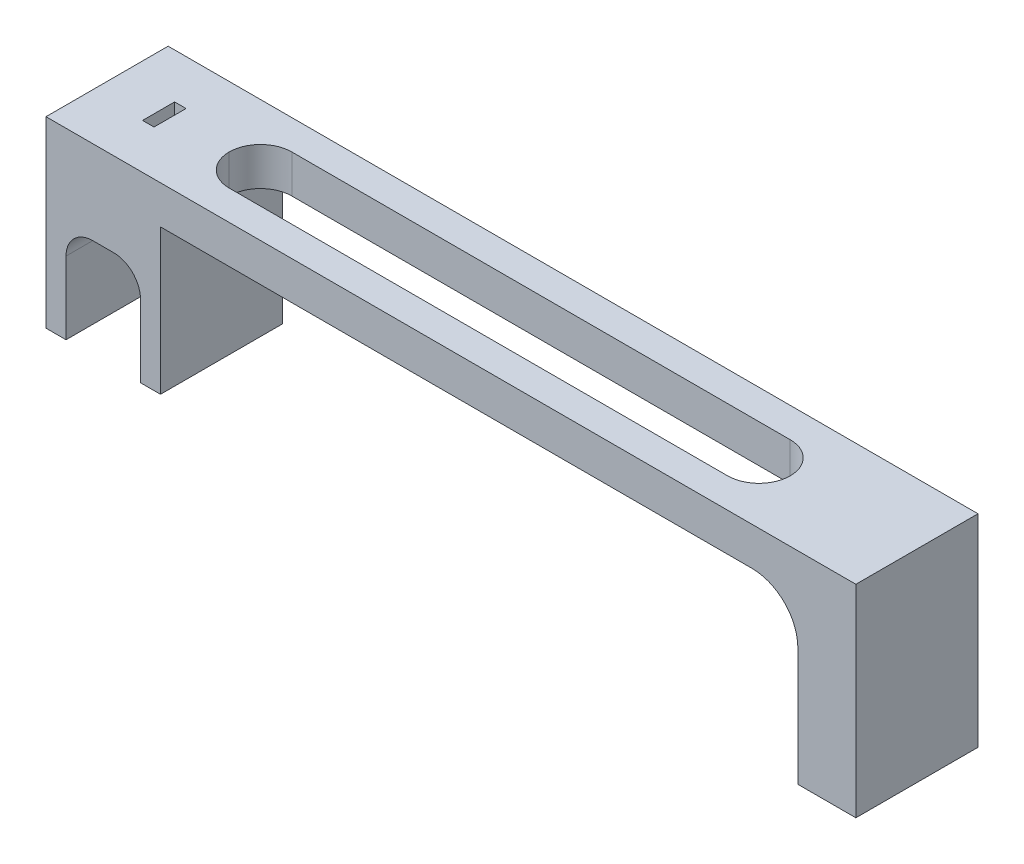
ISO-10303-21;
HEADER;
FILE_DESCRIPTION(('STEP AP214'),'2;1');
FILE_NAME('part.step','',(''),(''),'','','');
FILE_SCHEMA(('AUTOMOTIVE_DESIGN { 1 0 10303 214 1 1 1 1 }'));
ENDSEC;
DATA;
#1=APPLICATION_CONTEXT('core data for automotive mechanical design processes');
#2=APPLICATION_PROTOCOL_DEFINITION('international standard','automotive_design',2000,#1);
#3=PRODUCT_CONTEXT('',#1,'mechanical');
#4=PRODUCT('Part','Part','',(#3));
#5=PRODUCT_RELATED_PRODUCT_CATEGORY('part','',(#4));
#6=PRODUCT_DEFINITION_FORMATION('','',#4);
#7=PRODUCT_DEFINITION_CONTEXT('part definition',#1,'design');
#8=PRODUCT_DEFINITION('design','',#6,#7);
#9=PRODUCT_DEFINITION_SHAPE('','',#8);
#10=(LENGTH_UNIT() NAMED_UNIT(*) SI_UNIT(.MILLI.,.METRE.));
#11=(NAMED_UNIT(*) PLANE_ANGLE_UNIT() SI_UNIT($,.RADIAN.));
#12=(NAMED_UNIT(*) SI_UNIT($,.STERADIAN.) SOLID_ANGLE_UNIT());
#13=UNCERTAINTY_MEASURE_WITH_UNIT(LENGTH_MEASURE(1.E-05),#10,'distance_accuracy_value','');
#14=(GEOMETRIC_REPRESENTATION_CONTEXT(3) GLOBAL_UNCERTAINTY_ASSIGNED_CONTEXT((#13)) GLOBAL_UNIT_ASSIGNED_CONTEXT((#10,
#11,#12)) REPRESENTATION_CONTEXT('',''));
#15=CARTESIAN_POINT('',(0.,0.,0.));
#16=DIRECTION('',(0.,0.,1.));
#17=DIRECTION('',(1.,0.,0.));
#18=AXIS2_PLACEMENT_3D('',#15,#16,#17);
#19=CARTESIAN_POINT('',(-96.,0.,16.));
#20=DIRECTION('',(0.,1.,0.));
#21=DIRECTION('',(0.,0.,1.));
#22=AXIS2_PLACEMENT_3D('',#19,#20,#21);
#23=PLANE('',#22);
#24=CARTESIAN_POINT('',(-78.4,0.,7.99999999999999));
#25=DIRECTION('',(0.,1.,0.));
#26=DIRECTION('',(0.,0.,1.));
#27=AXIS2_PLACEMENT_3D('',#24,#25,#26);
#28=CIRCLE('',#27,4.1);
#29=CARTESIAN_POINT('',(-78.4,0.,3.9));
#30=VERTEX_POINT('',#29);
#31=CARTESIAN_POINT('',(-82.5,0.,7.99999999999999));
#32=VERTEX_POINT('',#31);
#33=EDGE_CURVE('E410',#30,#32,#28,.T.);
#34=ORIENTED_EDGE('',*,*,#33,.T.);
#35=CARTESIAN_POINT('',(-78.4,0.,8.));
#36=DIRECTION('',(0.,1.,0.));
#37=DIRECTION('',(0.,0.,1.));
#38=AXIS2_PLACEMENT_3D('',#35,#36,#37);
#39=CIRCLE('',#38,4.1);
#40=CARTESIAN_POINT('',(-78.4,0.,12.1));
#41=VERTEX_POINT('',#40);
#42=EDGE_CURVE('E416',#32,#41,#39,.T.);
#43=ORIENTED_EDGE('',*,*,#42,.T.);
#44=DIRECTION('',(-1.,0.,0.));
#45=VECTOR('',#44,1.);
#46=CARTESIAN_POINT('',(-9.,0.,12.1));
#47=LINE('',#46,#45);
#48=CARTESIAN_POINT('',(-13.1,0.,12.1));
#49=VERTEX_POINT('',#48);
#50=EDGE_CURVE('E322',#49,#41,#47,.T.);
#51=ORIENTED_EDGE('',*,*,#50,.F.);
#52=CARTESIAN_POINT('',(-13.1,0.,8.));
#53=DIRECTION('',(0.,1.,0.));
#54=DIRECTION('',(0.,0.,1.));
#55=AXIS2_PLACEMENT_3D('',#52,#53,#54);
#56=CIRCLE('',#55,4.1);
#57=CARTESIAN_POINT('',(-9.,0.,8.));
#58=VERTEX_POINT('',#57);
#59=EDGE_CURVE('E428',#49,#58,#56,.T.);
#60=ORIENTED_EDGE('',*,*,#59,.T.);
#61=CARTESIAN_POINT('',(-13.1,0.,8.));
#62=DIRECTION('',(0.,1.,0.));
#63=DIRECTION('',(0.,0.,1.));
#64=AXIS2_PLACEMENT_3D('',#61,#62,#63);
#65=CIRCLE('',#64,4.1);
#66=CARTESIAN_POINT('',(-13.1,0.,3.9));
#67=VERTEX_POINT('',#66);
#68=EDGE_CURVE('E422',#58,#67,#65,.T.);
#69=ORIENTED_EDGE('',*,*,#68,.T.);
#70=DIRECTION('',(1.,0.,0.));
#71=VECTOR('',#70,1.);
#72=CARTESIAN_POINT('',(-9.,0.,3.90000000000001));
#73=LINE('',#72,#71);
#74=EDGE_CURVE('E323',#30,#67,#73,.T.);
#75=ORIENTED_EDGE('',*,*,#74,.F.);
#76=EDGE_LOOP('',(#34,#43,#51,#60,#69,#75));
#77=FACE_BOUND('',#76,.T.);
#78=DIRECTION('',(1.,0.,0.));
#79=VECTOR('',#78,1.);
#80=CARTESIAN_POINT('',(-96.,0.,0.));
#81=LINE('',#80,#79);
#82=CARTESIAN_POINT('',(-83.5,0.,0.));
#83=VERTEX_POINT('',#82);
#84=CARTESIAN_POINT('',(-6.00000000000001,0.,0.));
#85=VERTEX_POINT('',#84);
#86=EDGE_CURVE('E312',#83,#85,#81,.T.);
#87=ORIENTED_EDGE('',*,*,#86,.T.);
#88=DIRECTION('',(0.,0.,-1.));
#89=VECTOR('',#88,1.);
#90=CARTESIAN_POINT('',(-6.,0.,16.));
#91=LINE('',#90,#89);
#92=CARTESIAN_POINT('',(-6.00000000000001,0.,16.));
#93=VERTEX_POINT('',#92);
#94=EDGE_CURVE('E57',#85,#93,#91,.F.);
#95=ORIENTED_EDGE('',*,*,#94,.T.);
#96=DIRECTION('',(1.,0.,0.));
#97=VECTOR('',#96,1.);
#98=CARTESIAN_POINT('',(-96.,0.,16.));
#99=LINE('',#98,#97);
#100=CARTESIAN_POINT('',(-83.5,0.,16.));
#101=VERTEX_POINT('',#100);
#102=EDGE_CURVE('E331',#101,#93,#99,.T.);
#103=ORIENTED_EDGE('',*,*,#102,.F.);
#104=DIRECTION('',(0.,0.,1.));
#105=VECTOR('',#104,1.);
#106=CARTESIAN_POINT('',(-83.5,0.,16.));
#107=LINE('',#106,#105);
#108=EDGE_CURVE('E219',#83,#101,#107,.T.);
#109=ORIENTED_EDGE('',*,*,#108,.F.);
#110=EDGE_LOOP('',(#87,#95,#103,#109));
#111=FACE_BOUND('',#110,.T.);
#112=ADVANCED_FACE('F41',(#77,#111),#23,.F.);
#113=CARTESIAN_POINT('',(0.,0.,16.));
#114=DIRECTION('',(1.,0.,0.));
#115=DIRECTION('',(0.,1.,0.));
#116=AXIS2_PLACEMENT_3D('',#113,#114,#115);
#117=PLANE('',#116);
#118=DIRECTION('',(0.,-1.,0.));
#119=VECTOR('',#118,1.);
#120=CARTESIAN_POINT('',(0.,0.,16.));
#121=LINE('',#120,#119);
#122=CARTESIAN_POINT('',(0.,-6.,16.));
#123=VERTEX_POINT('',#122);
#124=CARTESIAN_POINT('',(0.,-21.5,16.));
#125=VERTEX_POINT('',#124);
#126=EDGE_CURVE('E334',#123,#125,#121,.T.);
#127=ORIENTED_EDGE('',*,*,#126,.F.);
#128=DIRECTION('',(0.,0.,-1.));
#129=VECTOR('',#128,1.);
#130=CARTESIAN_POINT('',(0.,-6.,0.));
#131=LINE('',#130,#129);
#132=CARTESIAN_POINT('',(0.,-6.,0.));
#133=VERTEX_POINT('',#132);
#134=EDGE_CURVE('E465',#123,#133,#131,.T.);
#135=ORIENTED_EDGE('',*,*,#134,.T.);
#136=DIRECTION('',(0.,-1.,0.));
#137=VECTOR('',#136,1.);
#138=CARTESIAN_POINT('',(0.,0.,0.));
#139=LINE('',#138,#137);
#140=CARTESIAN_POINT('',(0.,-21.5,0.));
#141=VERTEX_POINT('',#140);
#142=EDGE_CURVE('E350',#133,#141,#139,.T.);
#143=ORIENTED_EDGE('',*,*,#142,.T.);
#144=DIRECTION('',(0.,0.,-1.));
#145=VECTOR('',#144,1.);
#146=CARTESIAN_POINT('',(0.,-21.5,16.));
#147=LINE('',#146,#145);
#148=EDGE_CURVE('E368',#125,#141,#147,.T.);
#149=ORIENTED_EDGE('',*,*,#148,.F.);
#150=EDGE_LOOP('',(#127,#135,#143,#149));
#151=FACE_BOUND('',#150,.T.);
#152=ADVANCED_FACE('F474',(#151),#117,.F.);
#153=CARTESIAN_POINT('',(0.,-21.5,16.));
#154=DIRECTION('',(0.,1.,0.));
#155=DIRECTION('',(0.,0.,1.));
#156=AXIS2_PLACEMENT_3D('',#153,#154,#155);
#157=PLANE('',#156);
#158=DIRECTION('',(1.,0.,0.));
#159=VECTOR('',#158,1.);
#160=CARTESIAN_POINT('',(0.,-21.5,0.));
#161=LINE('',#160,#159);
#162=CARTESIAN_POINT('',(7.6,-21.5,0.));
#163=VERTEX_POINT('',#162);
#164=EDGE_CURVE('E353',#141,#163,#161,.T.);
#165=ORIENTED_EDGE('',*,*,#164,.T.);
#166=DIRECTION('',(0.,0.,-1.));
#167=VECTOR('',#166,1.);
#168=CARTESIAN_POINT('',(7.6,-21.5,16.));
#169=LINE('',#168,#167);
#170=CARTESIAN_POINT('',(7.6,-21.5,16.));
#171=VERTEX_POINT('',#170);
#172=EDGE_CURVE('E364',#171,#163,#169,.T.);
#173=ORIENTED_EDGE('',*,*,#172,.F.);
#174=DIRECTION('',(1.,0.,0.));
#175=VECTOR('',#174,1.);
#176=CARTESIAN_POINT('',(0.,-21.5,16.));
#177=LINE('',#176,#175);
#178=EDGE_CURVE('E338',#125,#171,#177,.T.);
#179=ORIENTED_EDGE('',*,*,#178,.F.);
#180=ORIENTED_EDGE('',*,*,#148,.T.);
#181=EDGE_LOOP('',(#165,#173,#179,#180));
#182=FACE_BOUND('',#181,.T.);
#183=ADVANCED_FACE('F483',(#182),#157,.F.);
#184=CARTESIAN_POINT('',(7.6,-21.5,16.));
#185=DIRECTION('',(-1.,0.,0.));
#186=DIRECTION('',(0.,0.,1.));
#187=AXIS2_PLACEMENT_3D('',#184,#185,#186);
#188=PLANE('',#187);
#189=DIRECTION('',(0.,1.,0.));
#190=VECTOR('',#189,1.);
#191=CARTESIAN_POINT('',(7.6,-21.5,0.));
#192=LINE('',#191,#190);
#193=CARTESIAN_POINT('',(7.6,5.00000000000001,0.));
#194=VERTEX_POINT('',#193);
#195=EDGE_CURVE('E356',#163,#194,#192,.T.);
#196=ORIENTED_EDGE('',*,*,#195,.T.);
#197=DIRECTION('',(0.,0.,-1.));
#198=VECTOR('',#197,1.);
#199=CARTESIAN_POINT('',(7.6,5.00000000000001,16.));
#200=LINE('',#199,#198);
#201=CARTESIAN_POINT('',(7.6,5.00000000000001,16.));
#202=VERTEX_POINT('',#201);
#203=EDGE_CURVE('E347',#202,#194,#200,.T.);
#204=ORIENTED_EDGE('',*,*,#203,.F.);
#205=DIRECTION('',(0.,1.,0.));
#206=VECTOR('',#205,1.);
#207=CARTESIAN_POINT('',(7.6,-21.5,16.));
#208=LINE('',#207,#206);
#209=EDGE_CURVE('E341',#171,#202,#208,.T.);
#210=ORIENTED_EDGE('',*,*,#209,.F.);
#211=ORIENTED_EDGE('',*,*,#172,.T.);
#212=EDGE_LOOP('',(#196,#204,#210,#211));
#213=FACE_BOUND('',#212,.T.);
#214=ADVANCED_FACE('F487',(#213),#188,.F.);
#215=CARTESIAN_POINT('',(7.6,5.00000000000001,16.));
#216=DIRECTION('',(0.,-1.,0.));
#217=DIRECTION('',(1.,0.,0.));
#218=AXIS2_PLACEMENT_3D('',#215,#216,#217);
#219=PLANE('',#218);
#220=DIRECTION('',(1.,0.,0.));
#221=VECTOR('',#220,1.);
#222=CARTESIAN_POINT('',(7.6,5.00000000000001,5.9));
#223=LINE('',#222,#221);
#224=CARTESIAN_POINT('',(-91.75,5.,5.9));
#225=VERTEX_POINT('',#224);
#226=CARTESIAN_POINT('',(-90.25,5.,5.9));
#227=VERTEX_POINT('',#226);
#228=EDGE_CURVE('E388',#225,#227,#223,.T.);
#229=ORIENTED_EDGE('',*,*,#228,.T.);
#230=DIRECTION('',(0.,0.,1.));
#231=VECTOR('',#230,1.);
#232=CARTESIAN_POINT('',(-90.25,5.,16.));
#233=LINE('',#232,#231);
#234=CARTESIAN_POINT('',(-90.25,5.,10.1));
#235=VERTEX_POINT('',#234);
#236=EDGE_CURVE('E392',#227,#235,#233,.T.);
#237=ORIENTED_EDGE('',*,*,#236,.T.);
#238=DIRECTION('',(-1.,0.,0.));
#239=VECTOR('',#238,1.);
#240=CARTESIAN_POINT('',(7.6,5.00000000000001,10.1));
#241=LINE('',#240,#239);
#242=CARTESIAN_POINT('',(-91.75,5.,10.1));
#243=VERTEX_POINT('',#242);
#244=EDGE_CURVE('E380',#235,#243,#241,.T.);
#245=ORIENTED_EDGE('',*,*,#244,.T.);
#246=DIRECTION('',(0.,0.,-1.));
#247=VECTOR('',#246,1.);
#248=CARTESIAN_POINT('',(-91.75,5.,16.));
#249=LINE('',#248,#247);
#250=EDGE_CURVE('E384',#243,#225,#249,.T.);
#251=ORIENTED_EDGE('',*,*,#250,.T.);
#252=EDGE_LOOP('',(#229,#237,#245,#251));
#253=FACE_BOUND('',#252,.T.);
#254=DIRECTION('',(0.,0.,1.));
#255=VECTOR('',#254,1.);
#256=CARTESIAN_POINT('',(-98.5,5.,0.));
#257=LINE('',#256,#255);
#258=CARTESIAN_POINT('',(-98.5,5.,0.));
#259=VERTEX_POINT('',#258);
#260=CARTESIAN_POINT('',(-98.5,5.,16.));
#261=VERTEX_POINT('',#260);
#262=EDGE_CURVE('E268',#259,#261,#257,.T.);
#263=ORIENTED_EDGE('',*,*,#262,.T.);
#264=DIRECTION('',(-1.,0.,0.));
#265=VECTOR('',#264,1.);
#266=CARTESIAN_POINT('',(7.6,5.00000000000001,16.));
#267=LINE('',#266,#265);
#268=EDGE_CURVE('E344',#202,#261,#267,.T.);
#269=ORIENTED_EDGE('',*,*,#268,.F.);
#270=ORIENTED_EDGE('',*,*,#203,.T.);
#271=DIRECTION('',(-1.,0.,0.));
#272=VECTOR('',#271,1.);
#273=CARTESIAN_POINT('',(7.6,5.00000000000001,0.));
#274=LINE('',#273,#272);
#275=EDGE_CURVE('E335',#194,#259,#274,.T.);
#276=ORIENTED_EDGE('',*,*,#275,.T.);
#277=EDGE_LOOP('',(#263,#269,#270,#276));
#278=FACE_BOUND('',#277,.T.);
#279=CARTESIAN_POINT('',(-13.1,5.00000000000001,8.));
#280=DIRECTION('',(0.,-1.,0.));
#281=DIRECTION('',(1.,0.,0.));
#282=AXIS2_PLACEMENT_3D('',#279,#280,#281);
#283=CIRCLE('',#282,4.1);
#284=CARTESIAN_POINT('',(-13.1,5.00000000000001,3.9));
#285=VERTEX_POINT('',#284);
#286=CARTESIAN_POINT('',(-9.,5.00000000000001,8.));
#287=VERTEX_POINT('',#286);
#288=EDGE_CURVE('E425',#285,#287,#283,.T.);
#289=ORIENTED_EDGE('',*,*,#288,.T.);
#290=CARTESIAN_POINT('',(-13.1,5.00000000000001,8.));
#291=DIRECTION('',(0.,-1.,0.));
#292=DIRECTION('',(1.,0.,0.));
#293=AXIS2_PLACEMENT_3D('',#290,#291,#292);
#294=CIRCLE('',#293,4.1);
#295=CARTESIAN_POINT('',(-13.1,5.00000000000001,12.1));
#296=VERTEX_POINT('',#295);
#297=EDGE_CURVE('E431',#287,#296,#294,.T.);
#298=ORIENTED_EDGE('',*,*,#297,.T.);
#299=DIRECTION('',(-1.,0.,0.));
#300=VECTOR('',#299,1.);
#301=CARTESIAN_POINT('',(7.6,5.00000000000001,12.1));
#302=LINE('',#301,#300);
#303=CARTESIAN_POINT('',(-78.4,5.,12.1));
#304=VERTEX_POINT('',#303);
#305=EDGE_CURVE('E376',#296,#304,#302,.T.);
#306=ORIENTED_EDGE('',*,*,#305,.T.);
#307=CARTESIAN_POINT('',(-78.4,5.,8.));
#308=DIRECTION('',(0.,-1.,0.));
#309=DIRECTION('',(1.,0.,0.));
#310=AXIS2_PLACEMENT_3D('',#307,#308,#309);
#311=CIRCLE('',#310,4.1);
#312=CARTESIAN_POINT('',(-82.5,5.,7.99999999999999));
#313=VERTEX_POINT('',#312);
#314=EDGE_CURVE('E419',#304,#313,#311,.T.);
#315=ORIENTED_EDGE('',*,*,#314,.T.);
#316=CARTESIAN_POINT('',(-78.4,5.,7.99999999999999));
#317=DIRECTION('',(0.,-1.,0.));
#318=DIRECTION('',(1.,0.,0.));
#319=AXIS2_PLACEMENT_3D('',#316,#317,#318);
#320=CIRCLE('',#319,4.1);
#321=CARTESIAN_POINT('',(-78.4,5.,3.9));
#322=VERTEX_POINT('',#321);
#323=EDGE_CURVE('E413',#313,#322,#320,.T.);
#324=ORIENTED_EDGE('',*,*,#323,.T.);
#325=DIRECTION('',(1.,0.,0.));
#326=VECTOR('',#325,1.);
#327=CARTESIAN_POINT('',(7.6,5.00000000000001,3.90000000000001));
#328=LINE('',#327,#326);
#329=EDGE_CURVE('E372',#322,#285,#328,.T.);
#330=ORIENTED_EDGE('',*,*,#329,.T.);
#331=EDGE_LOOP('',(#289,#298,#306,#315,#324,#330));
#332=FACE_BOUND('',#331,.T.);
#333=ADVANCED_FACE('F556',(#253,#278,#332),#219,.F.);
#334=CARTESIAN_POINT('',(0.,0.,16.));
#335=DIRECTION('',(0.,0.,1.));
#336=DIRECTION('',(1.,0.,0.));
#337=AXIS2_PLACEMENT_3D('',#334,#335,#336);
#338=PLANE('',#337);
#339=DIRECTION('',(0.,1.,0.));
#340=VECTOR('',#339,1.);
#341=CARTESIAN_POINT('',(-83.5,-19.,16.));
#342=LINE('',#341,#340);
#343=CARTESIAN_POINT('',(-83.5,-19.,16.));
#344=VERTEX_POINT('',#343);
#345=EDGE_CURVE('E244',#344,#101,#342,.T.);
#346=ORIENTED_EDGE('',*,*,#345,.T.);
#347=ORIENTED_EDGE('',*,*,#102,.T.);
#348=CARTESIAN_POINT('',(-6.,-6.,16.));
#349=DIRECTION('',(0.,0.,1.));
#350=DIRECTION('',(1.,0.,0.));
#351=AXIS2_PLACEMENT_3D('',#348,#349,#350);
#352=CIRCLE('',#351,6.);
#353=EDGE_CURVE('E11',#93,#123,#352,.F.);
#354=ORIENTED_EDGE('',*,*,#353,.T.);
#355=ORIENTED_EDGE('',*,*,#126,.T.);
#356=ORIENTED_EDGE('',*,*,#178,.T.);
#357=ORIENTED_EDGE('',*,*,#209,.T.);
#358=ORIENTED_EDGE('',*,*,#268,.T.);
#359=DIRECTION('',(0.,-1.,0.));
#360=VECTOR('',#359,1.);
#361=CARTESIAN_POINT('',(-98.5,5.,16.));
#362=LINE('',#361,#360);
#363=CARTESIAN_POINT('',(-98.5,-19.,16.));
#364=VERTEX_POINT('',#363);
#365=EDGE_CURVE('E277',#261,#364,#362,.T.);
#366=ORIENTED_EDGE('',*,*,#365,.T.);
#367=DIRECTION('',(-1.,0.,0.));
#368=VECTOR('',#367,1.);
#369=CARTESIAN_POINT('',(0.,-19.,16.));
#370=LINE('',#369,#368);
#371=CARTESIAN_POINT('',(-95.875,-19.,16.));
#372=VERTEX_POINT('',#371);
#373=EDGE_CURVE('E260',#372,#364,#370,.T.);
#374=ORIENTED_EDGE('',*,*,#373,.F.);
#375=DIRECTION('',(0.,-1.,0.));
#376=VECTOR('',#375,1.);
#377=CARTESIAN_POINT('',(-95.875,5.,16.));
#378=LINE('',#377,#376);
#379=CARTESIAN_POINT('',(-95.875,-9.5,16.));
#380=VERTEX_POINT('',#379);
#381=EDGE_CURVE('E280',#380,#372,#378,.T.);
#382=ORIENTED_EDGE('',*,*,#381,.F.);
#383=CARTESIAN_POINT('',(-92.375,-9.5,16.));
#384=DIRECTION('',(0.,0.,1.));
#385=DIRECTION('',(1.,0.,0.));
#386=AXIS2_PLACEMENT_3D('',#383,#384,#385);
#387=CIRCLE('',#386,3.5);
#388=CARTESIAN_POINT('',(-92.375,-6.,16.));
#389=VERTEX_POINT('',#388);
#390=EDGE_CURVE('E462',#380,#389,#387,.F.);
#391=ORIENTED_EDGE('',*,*,#390,.T.);
#392=DIRECTION('',(1.,0.,0.));
#393=VECTOR('',#392,1.);
#394=CARTESIAN_POINT('',(0.,-5.99999999999999,16.));
#395=LINE('',#394,#393);
#396=CARTESIAN_POINT('',(-89.625,-6.,16.));
#397=VERTEX_POINT('',#396);
#398=EDGE_CURVE('E288',#389,#397,#395,.T.);
#399=ORIENTED_EDGE('',*,*,#398,.T.);
#400=CARTESIAN_POINT('',(-89.625,-9.5,16.));
#401=DIRECTION('',(0.,0.,1.));
#402=DIRECTION('',(1.,0.,0.));
#403=AXIS2_PLACEMENT_3D('',#400,#401,#402);
#404=CIRCLE('',#403,3.5);
#405=CARTESIAN_POINT('',(-86.125,-9.5,16.));
#406=VERTEX_POINT('',#405);
#407=EDGE_CURVE('E453',#397,#406,#404,.F.);
#408=ORIENTED_EDGE('',*,*,#407,.T.);
#409=DIRECTION('',(0.,1.,0.));
#410=VECTOR('',#409,1.);
#411=CARTESIAN_POINT('',(-86.125,-19.,16.));
#412=LINE('',#411,#410);
#413=CARTESIAN_POINT('',(-86.125,-19.,16.));
#414=VERTEX_POINT('',#413);
#415=EDGE_CURVE('E241',#414,#406,#412,.T.);
#416=ORIENTED_EDGE('',*,*,#415,.F.);
#417=DIRECTION('',(-1.,0.,0.));
#418=VECTOR('',#417,1.);
#419=CARTESIAN_POINT('',(0.,-19.,16.));
#420=LINE('',#419,#418);
#421=EDGE_CURVE('E232',#344,#414,#420,.T.);
#422=ORIENTED_EDGE('',*,*,#421,.F.);
#423=EDGE_LOOP('',(#346,#347,#354,#355,#356,#357,#358,#366,#374,#382,#391,#399,#408,#416,#422));
#424=FACE_BOUND('',#423,.T.);
#425=ADVANCED_FACE('F491',(#424),#338,.T.);
#426=CARTESIAN_POINT('',(0.,0.,0.));
#427=DIRECTION('',(0.,0.,1.));
#428=DIRECTION('',(1.,0.,0.));
#429=AXIS2_PLACEMENT_3D('',#426,#427,#428);
#430=PLANE('',#429);
#431=ORIENTED_EDGE('',*,*,#86,.F.);
#432=DIRECTION('',(0.,1.,0.));
#433=VECTOR('',#432,1.);
#434=CARTESIAN_POINT('',(-83.5,-19.,0.));
#435=LINE('',#434,#433);
#436=CARTESIAN_POINT('',(-83.5,-19.,0.));
#437=VERTEX_POINT('',#436);
#438=EDGE_CURVE('E220',#437,#83,#435,.T.);
#439=ORIENTED_EDGE('',*,*,#438,.F.);
#440=DIRECTION('',(1.,0.,0.));
#441=VECTOR('',#440,1.);
#442=CARTESIAN_POINT('',(0.,-19.,0.));
#443=LINE('',#442,#441);
#444=CARTESIAN_POINT('',(-86.125,-19.,0.));
#445=VERTEX_POINT('',#444);
#446=EDGE_CURVE('E223',#445,#437,#443,.T.);
#447=ORIENTED_EDGE('',*,*,#446,.F.);
#448=DIRECTION('',(0.,1.,0.));
#449=VECTOR('',#448,1.);
#450=CARTESIAN_POINT('',(-86.125,-19.,0.));
#451=LINE('',#450,#449);
#452=CARTESIAN_POINT('',(-86.125,-9.5,0.));
#453=VERTEX_POINT('',#452);
#454=EDGE_CURVE('E209',#445,#453,#451,.T.);
#455=ORIENTED_EDGE('',*,*,#454,.T.);
#456=CARTESIAN_POINT('',(-89.625,-9.5,0.));
#457=DIRECTION('',(0.,0.,1.));
#458=DIRECTION('',(1.,0.,0.));
#459=AXIS2_PLACEMENT_3D('',#456,#457,#458);
#460=CIRCLE('',#459,3.5);
#461=CARTESIAN_POINT('',(-89.625,-6.,0.));
#462=VERTEX_POINT('',#461);
#463=EDGE_CURVE('E456',#453,#462,#460,.T.);
#464=ORIENTED_EDGE('',*,*,#463,.T.);
#465=DIRECTION('',(-1.,0.,0.));
#466=VECTOR('',#465,1.);
#467=CARTESIAN_POINT('',(0.,-5.99999999999999,0.));
#468=LINE('',#467,#466);
#469=CARTESIAN_POINT('',(-92.375,-6.,0.));
#470=VERTEX_POINT('',#469);
#471=EDGE_CURVE('E276',#462,#470,#468,.T.);
#472=ORIENTED_EDGE('',*,*,#471,.T.);
#473=CARTESIAN_POINT('',(-92.375,-9.5,0.));
#474=DIRECTION('',(0.,0.,1.));
#475=DIRECTION('',(1.,0.,0.));
#476=AXIS2_PLACEMENT_3D('',#473,#474,#475);
#477=CIRCLE('',#476,3.5);
#478=CARTESIAN_POINT('',(-95.875,-9.5,0.));
#479=VERTEX_POINT('',#478);
#480=EDGE_CURVE('E459',#470,#479,#477,.T.);
#481=ORIENTED_EDGE('',*,*,#480,.T.);
#482=DIRECTION('',(0.,-1.,0.));
#483=VECTOR('',#482,1.);
#484=CARTESIAN_POINT('',(-95.875,5.,0.));
#485=LINE('',#484,#483);
#486=CARTESIAN_POINT('',(-95.875,-19.,0.));
#487=VERTEX_POINT('',#486);
#488=EDGE_CURVE('E272',#479,#487,#485,.T.);
#489=ORIENTED_EDGE('',*,*,#488,.T.);
#490=DIRECTION('',(1.,0.,0.));
#491=VECTOR('',#490,1.);
#492=CARTESIAN_POINT('',(0.,-19.,0.));
#493=LINE('',#492,#491);
#494=CARTESIAN_POINT('',(-98.5,-19.,0.));
#495=VERTEX_POINT('',#494);
#496=EDGE_CURVE('E252',#495,#487,#493,.T.);
#497=ORIENTED_EDGE('',*,*,#496,.F.);
#498=DIRECTION('',(0.,-1.,0.));
#499=VECTOR('',#498,1.);
#500=CARTESIAN_POINT('',(-98.5,5.,0.));
#501=LINE('',#500,#499);
#502=EDGE_CURVE('E273',#259,#495,#501,.T.);
#503=ORIENTED_EDGE('',*,*,#502,.F.);
#504=ORIENTED_EDGE('',*,*,#275,.F.);
#505=ORIENTED_EDGE('',*,*,#195,.F.);
#506=ORIENTED_EDGE('',*,*,#164,.F.);
#507=ORIENTED_EDGE('',*,*,#142,.F.);
#508=CARTESIAN_POINT('',(-6.,-6.,0.));
#509=DIRECTION('',(0.,0.,1.));
#510=DIRECTION('',(1.,0.,0.));
#511=AXIS2_PLACEMENT_3D('',#508,#509,#510);
#512=CIRCLE('',#511,6.);
#513=EDGE_CURVE('E50',#133,#85,#512,.T.);
#514=ORIENTED_EDGE('',*,*,#513,.T.);
#515=EDGE_LOOP('',(#431,#439,#447,#455,#464,#472,#481,#489,#497,#503,#504,#505,#506,#507,#514));
#516=FACE_BOUND('',#515,.T.);
#517=ADVANCED_FACE('F224',(#516),#430,.F.);
#518=CARTESIAN_POINT('',(-9.,10.,12.1));
#519=DIRECTION('',(0.,0.,1.));
#520=DIRECTION('',(1.,0.,0.));
#521=AXIS2_PLACEMENT_3D('',#518,#519,#520);
#522=PLANE('',#521);
#523=ORIENTED_EDGE('',*,*,#50,.T.);
#524=DIRECTION('',(0.,-1.,0.));
#525=VECTOR('',#524,1.);
#526=CARTESIAN_POINT('',(-78.4,5.00000000000001,12.1));
#527=LINE('',#526,#525);
#528=EDGE_CURVE('E407',#41,#304,#527,.F.);
#529=ORIENTED_EDGE('',*,*,#528,.T.);
#530=ORIENTED_EDGE('',*,*,#305,.F.);
#531=DIRECTION('',(0.,-1.,0.));
#532=VECTOR('',#531,1.);
#533=CARTESIAN_POINT('',(-13.1,0.,12.1));
#534=LINE('',#533,#532);
#535=EDGE_CURVE('E404',#296,#49,#534,.T.);
#536=ORIENTED_EDGE('',*,*,#535,.T.);
#537=EDGE_LOOP('',(#523,#529,#530,#536));
#538=FACE_BOUND('',#537,.T.);
#539=ADVANCED_FACE('F580',(#538),#522,.F.);
#540=CARTESIAN_POINT('',(-9.,10.,3.90000000000001));
#541=DIRECTION('',(0.,0.,-1.));
#542=DIRECTION('',(-1.,0.,0.));
#543=AXIS2_PLACEMENT_3D('',#540,#541,#542);
#544=PLANE('',#543);
#545=ORIENTED_EDGE('',*,*,#329,.F.);
#546=DIRECTION('',(0.,-1.,0.));
#547=VECTOR('',#546,1.);
#548=CARTESIAN_POINT('',(-78.4,0.,3.9));
#549=LINE('',#548,#547);
#550=EDGE_CURVE('E400',#322,#30,#549,.T.);
#551=ORIENTED_EDGE('',*,*,#550,.T.);
#552=ORIENTED_EDGE('',*,*,#74,.T.);
#553=DIRECTION('',(0.,-1.,0.));
#554=VECTOR('',#553,1.);
#555=CARTESIAN_POINT('',(-13.1,5.00000000000001,3.9));
#556=LINE('',#555,#554);
#557=EDGE_CURVE('E396',#67,#285,#556,.F.);
#558=ORIENTED_EDGE('',*,*,#557,.T.);
#559=EDGE_LOOP('',(#545,#551,#552,#558));
#560=FACE_BOUND('',#559,.T.);
#561=ADVANCED_FACE('F572',(#560),#544,.F.);
#562=CARTESIAN_POINT('',(-90.25,10.,5.9));
#563=DIRECTION('',(1.,0.,0.));
#564=DIRECTION('',(0.,0.,-1.));
#565=AXIS2_PLACEMENT_3D('',#562,#563,#564);
#566=PLANE('',#565);
#567=DIRECTION('',(0.,-1.,0.));
#568=VECTOR('',#567,1.);
#569=CARTESIAN_POINT('',(-90.25,10.,5.9));
#570=LINE('',#569,#568);
#571=CARTESIAN_POINT('',(-90.25,-6.,5.9));
#572=VERTEX_POINT('',#571);
#573=EDGE_CURVE('E309',#227,#572,#570,.T.);
#574=ORIENTED_EDGE('',*,*,#573,.T.);
#575=DIRECTION('',(0.,0.,1.));
#576=VECTOR('',#575,1.);
#577=CARTESIAN_POINT('',(-90.25,-6.,0.));
#578=LINE('',#577,#576);
#579=CARTESIAN_POINT('',(-90.25,-6.,10.1));
#580=VERTEX_POINT('',#579);
#581=EDGE_CURVE('E300',#572,#580,#578,.T.);
#582=ORIENTED_EDGE('',*,*,#581,.T.);
#583=DIRECTION('',(0.,-1.,0.));
#584=VECTOR('',#583,1.);
#585=CARTESIAN_POINT('',(-90.25,10.,10.1));
#586=LINE('',#585,#584);
#587=EDGE_CURVE('E319',#235,#580,#586,.T.);
#588=ORIENTED_EDGE('',*,*,#587,.F.);
#589=ORIENTED_EDGE('',*,*,#236,.F.);
#590=EDGE_LOOP('',(#574,#582,#588,#589));
#591=FACE_BOUND('',#590,.T.);
#592=ADVANCED_FACE('F587',(#591),#566,.F.);
#593=CARTESIAN_POINT('',(-91.75,10.,5.9));
#594=DIRECTION('',(0.,0.,-1.));
#595=DIRECTION('',(-1.,0.,0.));
#596=AXIS2_PLACEMENT_3D('',#593,#594,#595);
#597=PLANE('',#596);
#598=DIRECTION('',(0.,-1.,0.));
#599=VECTOR('',#598,1.);
#600=CARTESIAN_POINT('',(-91.75,10.,5.9));
#601=LINE('',#600,#599);
#602=CARTESIAN_POINT('',(-91.75,-6.,5.9));
#603=VERTEX_POINT('',#602);
#604=EDGE_CURVE('E313',#225,#603,#601,.T.);
#605=ORIENTED_EDGE('',*,*,#604,.T.);
#606=DIRECTION('',(1.,0.,0.));
#607=VECTOR('',#606,1.);
#608=CARTESIAN_POINT('',(0.,-5.99999999999999,5.9));
#609=LINE('',#608,#607);
#610=EDGE_CURVE('E296',#603,#572,#609,.T.);
#611=ORIENTED_EDGE('',*,*,#610,.T.);
#612=ORIENTED_EDGE('',*,*,#573,.F.);
#613=ORIENTED_EDGE('',*,*,#228,.F.);
#614=EDGE_LOOP('',(#605,#611,#612,#613));
#615=FACE_BOUND('',#614,.T.);
#616=ADVANCED_FACE('F707',(#615),#597,.F.);
#617=CARTESIAN_POINT('',(-91.75,10.,5.9));
#618=DIRECTION('',(-1.,0.,0.));
#619=DIRECTION('',(0.,0.,1.));
#620=AXIS2_PLACEMENT_3D('',#617,#618,#619);
#621=PLANE('',#620);
#622=DIRECTION('',(0.,-1.,0.));
#623=VECTOR('',#622,1.);
#624=CARTESIAN_POINT('',(-91.75,10.,10.1));
#625=LINE('',#624,#623);
#626=CARTESIAN_POINT('',(-91.75,-6.,10.1));
#627=VERTEX_POINT('',#626);
#628=EDGE_CURVE('E316',#243,#627,#625,.T.);
#629=ORIENTED_EDGE('',*,*,#628,.T.);
#630=DIRECTION('',(0.,0.,-1.));
#631=VECTOR('',#630,1.);
#632=CARTESIAN_POINT('',(-91.75,-6.,0.));
#633=LINE('',#632,#631);
#634=EDGE_CURVE('E292',#627,#603,#633,.T.);
#635=ORIENTED_EDGE('',*,*,#634,.T.);
#636=ORIENTED_EDGE('',*,*,#604,.F.);
#637=ORIENTED_EDGE('',*,*,#250,.F.);
#638=EDGE_LOOP('',(#629,#635,#636,#637));
#639=FACE_BOUND('',#638,.T.);
#640=ADVANCED_FACE('F710',(#639),#621,.F.);
#641=CARTESIAN_POINT('',(-91.75,10.,10.1));
#642=DIRECTION('',(0.,0.,1.));
#643=DIRECTION('',(1.,0.,0.));
#644=AXIS2_PLACEMENT_3D('',#641,#642,#643);
#645=PLANE('',#644);
#646=ORIENTED_EDGE('',*,*,#587,.T.);
#647=DIRECTION('',(-1.,0.,0.));
#648=VECTOR('',#647,1.);
#649=CARTESIAN_POINT('',(0.,-5.99999999999999,10.1));
#650=LINE('',#649,#648);
#651=EDGE_CURVE('E304',#580,#627,#650,.T.);
#652=ORIENTED_EDGE('',*,*,#651,.T.);
#653=ORIENTED_EDGE('',*,*,#628,.F.);
#654=ORIENTED_EDGE('',*,*,#244,.F.);
#655=EDGE_LOOP('',(#646,#652,#653,#654));
#656=FACE_BOUND('',#655,.T.);
#657=ADVANCED_FACE('F516',(#656),#645,.F.);
#658=CARTESIAN_POINT('',(-78.4,10.,8.));
#659=DIRECTION('',(0.,1.,0.));
#660=DIRECTION('',(0.,0.,1.));
#661=AXIS2_PLACEMENT_3D('',#658,#659,#660);
#662=CYLINDRICAL_SURFACE('',#661,4.1);
#663=DIRECTION('',(0.,-1.,0.));
#664=VECTOR('',#663,1.);
#665=CARTESIAN_POINT('',(-82.5,0.,8.));
#666=LINE('',#665,#664);
#667=EDGE_CURVE('E327',#313,#32,#666,.T.);
#668=ORIENTED_EDGE('',*,*,#667,.F.);
#669=ORIENTED_EDGE('',*,*,#314,.F.);
#670=ORIENTED_EDGE('',*,*,#528,.F.);
#671=ORIENTED_EDGE('',*,*,#42,.F.);
#672=EDGE_LOOP('',(#668,#669,#670,#671));
#673=FACE_BOUND('',#672,.T.);
#674=ADVANCED_FACE('F512',(#673),#662,.F.);
#675=CARTESIAN_POINT('',(-78.4,10.,7.99999999999999));
#676=DIRECTION('',(0.,1.,0.));
#677=DIRECTION('',(0.,0.,1.));
#678=AXIS2_PLACEMENT_3D('',#675,#676,#677);
#679=CYLINDRICAL_SURFACE('',#678,4.1);
#680=ORIENTED_EDGE('',*,*,#323,.F.);
#681=ORIENTED_EDGE('',*,*,#667,.T.);
#682=ORIENTED_EDGE('',*,*,#33,.F.);
#683=ORIENTED_EDGE('',*,*,#550,.F.);
#684=EDGE_LOOP('',(#680,#681,#682,#683));
#685=FACE_BOUND('',#684,.T.);
#686=ADVANCED_FACE('F508',(#685),#679,.F.);
#687=CARTESIAN_POINT('',(-13.1,10.,8.));
#688=DIRECTION('',(0.,1.,0.));
#689=DIRECTION('',(0.,0.,1.));
#690=AXIS2_PLACEMENT_3D('',#687,#688,#689);
#691=CYLINDRICAL_SURFACE('',#690,4.1);
#692=ORIENTED_EDGE('',*,*,#535,.F.);
#693=ORIENTED_EDGE('',*,*,#297,.F.);
#694=DIRECTION('',(0.,-1.,0.));
#695=VECTOR('',#694,1.);
#696=CARTESIAN_POINT('',(-9.,5.00000000000001,8.));
#697=LINE('',#696,#695);
#698=EDGE_CURVE('E308',#58,#287,#697,.F.);
#699=ORIENTED_EDGE('',*,*,#698,.F.);
#700=ORIENTED_EDGE('',*,*,#59,.F.);
#701=EDGE_LOOP('',(#692,#693,#699,#700));
#702=FACE_BOUND('',#701,.T.);
#703=ADVANCED_FACE('F511',(#702),#691,.F.);
#704=CARTESIAN_POINT('',(-13.1,10.,8.));
#705=DIRECTION('',(0.,1.,0.));
#706=DIRECTION('',(0.,0.,1.));
#707=AXIS2_PLACEMENT_3D('',#704,#705,#706);
#708=CYLINDRICAL_SURFACE('',#707,4.1);
#709=ORIENTED_EDGE('',*,*,#288,.F.);
#710=ORIENTED_EDGE('',*,*,#557,.F.);
#711=ORIENTED_EDGE('',*,*,#68,.F.);
#712=ORIENTED_EDGE('',*,*,#698,.T.);
#713=EDGE_LOOP('',(#709,#710,#711,#712));
#714=FACE_BOUND('',#713,.T.);
#715=ADVANCED_FACE('F518',(#714),#708,.F.);
#716=CARTESIAN_POINT('',(0.,-5.99999999999999,0.));
#717=DIRECTION('',(0.,1.,0.));
#718=DIRECTION('',(-1.,0.,0.));
#719=AXIS2_PLACEMENT_3D('',#716,#717,#718);
#720=PLANE('',#719);
#721=ORIENTED_EDGE('',*,*,#471,.F.);
#722=DIRECTION('',(0.,0.,1.));
#723=VECTOR('',#722,1.);
#724=CARTESIAN_POINT('',(-89.625,-6.,0.));
#725=LINE('',#724,#723);
#726=EDGE_CURVE('E444',#462,#397,#725,.T.);
#727=ORIENTED_EDGE('',*,*,#726,.T.);
#728=ORIENTED_EDGE('',*,*,#398,.F.);
#729=DIRECTION('',(0.,0.,-1.));
#730=VECTOR('',#729,1.);
#731=CARTESIAN_POINT('',(-92.375,-6.,0.));
#732=LINE('',#731,#730);
#733=EDGE_CURVE('E434',#389,#470,#732,.T.);
#734=ORIENTED_EDGE('',*,*,#733,.T.);
#735=EDGE_LOOP('',(#721,#727,#728,#734));
#736=FACE_BOUND('',#735,.T.);
#737=ORIENTED_EDGE('',*,*,#634,.F.);
#738=ORIENTED_EDGE('',*,*,#651,.F.);
#739=ORIENTED_EDGE('',*,*,#581,.F.);
#740=ORIENTED_EDGE('',*,*,#610,.F.);
#741=EDGE_LOOP('',(#737,#738,#739,#740));
#742=FACE_BOUND('',#741,.T.);
#743=ADVANCED_FACE('F521',(#736,#742),#720,.F.);
#744=CARTESIAN_POINT('',(-95.875,5.,0.));
#745=DIRECTION('',(1.,0.,0.));
#746=DIRECTION('',(0.,1.,0.));
#747=AXIS2_PLACEMENT_3D('',#744,#745,#746);
#748=PLANE('',#747);
#749=ORIENTED_EDGE('',*,*,#488,.F.);
#750=DIRECTION('',(0.,0.,-1.));
#751=VECTOR('',#750,1.);
#752=CARTESIAN_POINT('',(-95.875,-9.5,0.));
#753=LINE('',#752,#751);
#754=EDGE_CURVE('E450',#479,#380,#753,.F.);
#755=ORIENTED_EDGE('',*,*,#754,.T.);
#756=ORIENTED_EDGE('',*,*,#381,.T.);
#757=DIRECTION('',(0.,0.,1.));
#758=VECTOR('',#757,1.);
#759=CARTESIAN_POINT('',(-95.875,-19.,0.));
#760=LINE('',#759,#758);
#761=EDGE_CURVE('E256',#487,#372,#760,.T.);
#762=ORIENTED_EDGE('',*,*,#761,.F.);
#763=EDGE_LOOP('',(#749,#755,#756,#762));
#764=FACE_BOUND('',#763,.T.);
#765=ADVANCED_FACE('F544',(#764),#748,.T.);
#766=CARTESIAN_POINT('',(-98.5,5.,0.));
#767=DIRECTION('',(1.,0.,0.));
#768=DIRECTION('',(0.,1.,0.));
#769=AXIS2_PLACEMENT_3D('',#766,#767,#768);
#770=PLANE('',#769);
#771=DIRECTION('',(0.,0.,1.));
#772=VECTOR('',#771,1.);
#773=CARTESIAN_POINT('',(-98.5,-19.,0.));
#774=LINE('',#773,#772);
#775=EDGE_CURVE('E264',#495,#364,#774,.T.);
#776=ORIENTED_EDGE('',*,*,#775,.T.);
#777=ORIENTED_EDGE('',*,*,#365,.F.);
#778=ORIENTED_EDGE('',*,*,#262,.F.);
#779=ORIENTED_EDGE('',*,*,#502,.T.);
#780=EDGE_LOOP('',(#776,#777,#778,#779));
#781=FACE_BOUND('',#780,.T.);
#782=ADVANCED_FACE('F554',(#781),#770,.F.);
#783=CARTESIAN_POINT('',(0.,-19.,0.));
#784=DIRECTION('',(0.,-1.,0.));
#785=DIRECTION('',(1.,0.,0.));
#786=AXIS2_PLACEMENT_3D('',#783,#784,#785);
#787=PLANE('',#786);
#788=ORIENTED_EDGE('',*,*,#496,.T.);
#789=ORIENTED_EDGE('',*,*,#761,.T.);
#790=ORIENTED_EDGE('',*,*,#373,.T.);
#791=ORIENTED_EDGE('',*,*,#775,.F.);
#792=EDGE_LOOP('',(#788,#789,#790,#791));
#793=FACE_BOUND('',#792,.T.);
#794=ADVANCED_FACE('F549',(#793),#787,.T.);
#795=CARTESIAN_POINT('',(-83.5,-19.,0.));
#796=DIRECTION('',(-1.,0.,0.));
#797=DIRECTION('',(0.,-1.,0.));
#798=AXIS2_PLACEMENT_3D('',#795,#796,#797);
#799=PLANE('',#798);
#800=ORIENTED_EDGE('',*,*,#438,.T.);
#801=ORIENTED_EDGE('',*,*,#108,.T.);
#802=ORIENTED_EDGE('',*,*,#345,.F.);
#803=DIRECTION('',(0.,0.,1.));
#804=VECTOR('',#803,1.);
#805=CARTESIAN_POINT('',(-83.5,-19.,0.));
#806=LINE('',#805,#804);
#807=EDGE_CURVE('E228',#437,#344,#806,.T.);
#808=ORIENTED_EDGE('',*,*,#807,.F.);
#809=EDGE_LOOP('',(#800,#801,#802,#808));
#810=FACE_BOUND('',#809,.T.);
#811=ADVANCED_FACE('F652',(#810),#799,.F.);
#812=CARTESIAN_POINT('',(-86.125,-19.,0.));
#813=DIRECTION('',(-1.,0.,0.));
#814=DIRECTION('',(0.,-1.,0.));
#815=AXIS2_PLACEMENT_3D('',#812,#813,#814);
#816=PLANE('',#815);
#817=ORIENTED_EDGE('',*,*,#415,.T.);
#818=DIRECTION('',(0.,0.,1.));
#819=VECTOR('',#818,1.);
#820=CARTESIAN_POINT('',(-86.125,-9.5,0.));
#821=LINE('',#820,#819);
#822=EDGE_CURVE('E216',#406,#453,#821,.F.);
#823=ORIENTED_EDGE('',*,*,#822,.T.);
#824=ORIENTED_EDGE('',*,*,#454,.F.);
#825=DIRECTION('',(0.,0.,1.));
#826=VECTOR('',#825,1.);
#827=CARTESIAN_POINT('',(-86.125,-19.,0.));
#828=LINE('',#827,#826);
#829=EDGE_CURVE('E214',#445,#414,#828,.T.);
#830=ORIENTED_EDGE('',*,*,#829,.T.);
#831=EDGE_LOOP('',(#817,#823,#824,#830));
#832=FACE_BOUND('',#831,.T.);
#833=ADVANCED_FACE('F212',(#832),#816,.T.);
#834=CARTESIAN_POINT('',(0.,-19.,0.));
#835=DIRECTION('',(0.,-1.,0.));
#836=DIRECTION('',(1.,0.,0.));
#837=AXIS2_PLACEMENT_3D('',#834,#835,#836);
#838=PLANE('',#837);
#839=ORIENTED_EDGE('',*,*,#829,.F.);
#840=ORIENTED_EDGE('',*,*,#446,.T.);
#841=ORIENTED_EDGE('',*,*,#807,.T.);
#842=ORIENTED_EDGE('',*,*,#421,.T.);
#843=EDGE_LOOP('',(#839,#840,#841,#842));
#844=FACE_BOUND('',#843,.T.);
#845=ADVANCED_FACE('F230',(#844),#838,.T.);
#846=CARTESIAN_POINT('',(-89.625,-9.5,0.));
#847=DIRECTION('',(0.,0.,1.));
#848=DIRECTION('',(0.,-1.,0.));
#849=AXIS2_PLACEMENT_3D('',#846,#847,#848);
#850=CYLINDRICAL_SURFACE('',#849,3.5);
#851=ORIENTED_EDGE('',*,*,#463,.F.);
#852=ORIENTED_EDGE('',*,*,#822,.F.);
#853=ORIENTED_EDGE('',*,*,#407,.F.);
#854=ORIENTED_EDGE('',*,*,#726,.F.);
#855=EDGE_LOOP('',(#851,#852,#853,#854));
#856=FACE_BOUND('',#855,.T.);
#857=ADVANCED_FACE('F497',(#856),#850,.F.);
#858=CARTESIAN_POINT('',(-92.375,-9.5,0.));
#859=DIRECTION('',(0.,0.,-1.));
#860=DIRECTION('',(0.,1.,0.));
#861=AXIS2_PLACEMENT_3D('',#858,#859,#860);
#862=CYLINDRICAL_SURFACE('',#861,3.5);
#863=ORIENTED_EDGE('',*,*,#390,.F.);
#864=ORIENTED_EDGE('',*,*,#754,.F.);
#865=ORIENTED_EDGE('',*,*,#480,.F.);
#866=ORIENTED_EDGE('',*,*,#733,.F.);
#867=EDGE_LOOP('',(#863,#864,#865,#866));
#868=FACE_BOUND('',#867,.T.);
#869=ADVANCED_FACE('F493',(#868),#862,.F.);
#870=CARTESIAN_POINT('',(-6.,-6.,16.));
#871=DIRECTION('',(0.,0.,1.));
#872=DIRECTION('',(1.,0.,0.));
#873=AXIS2_PLACEMENT_3D('',#870,#871,#872);
#874=CYLINDRICAL_SURFACE('',#873,6.);
#875=ORIENTED_EDGE('',*,*,#353,.F.);
#876=ORIENTED_EDGE('',*,*,#94,.F.);
#877=ORIENTED_EDGE('',*,*,#513,.F.);
#878=ORIENTED_EDGE('',*,*,#134,.F.);
#879=EDGE_LOOP('',(#875,#876,#877,#878));
#880=FACE_BOUND('',#879,.T.);
#881=ADVANCED_FACE('F43',(#880),#874,.F.);
#882=CLOSED_SHELL('',(#112,#152,#183,#214,#333,#425,#517,#539,#561,#592,#616,#640,#657,#674,
#686,#703,#715,#743,#765,#782,#794,#811,#833,#845,#857,#869,#881));
#883=MANIFOLD_SOLID_BREP('B2',#882);
#884=ADVANCED_BREP_SHAPE_REPRESENTATION('',(#18,#883),#14);
#885=SHAPE_DEFINITION_REPRESENTATION(#9,#884);
ENDSEC;
END-ISO-10303-21;
